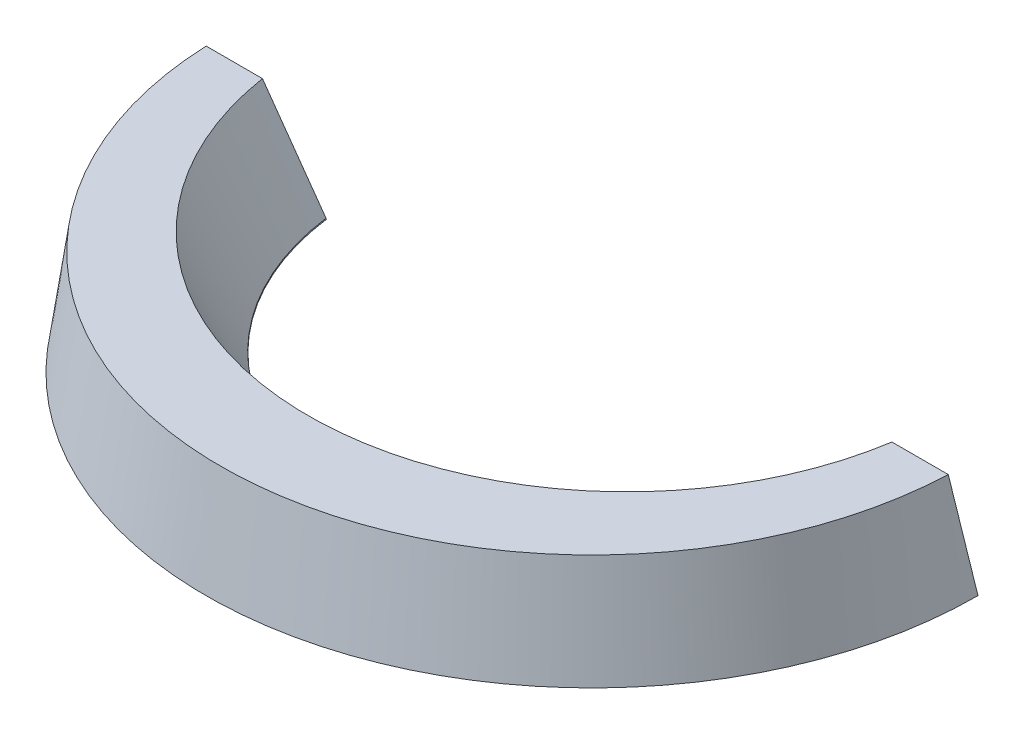
ISO-10303-21;
HEADER;
FILE_DESCRIPTION(('STEP AP214'),'2;1');
FILE_NAME('part.step','',(''),(''),'','','');
FILE_SCHEMA(('AUTOMOTIVE_DESIGN { 1 0 10303 214 1 1 1 1 }'));
ENDSEC;
DATA;
#1=APPLICATION_CONTEXT('core data for automotive mechanical design processes');
#2=APPLICATION_PROTOCOL_DEFINITION('international standard','automotive_design',2000,#1);
#3=PRODUCT_CONTEXT('',#1,'mechanical');
#4=PRODUCT('Part','Part','',(#3));
#5=PRODUCT_RELATED_PRODUCT_CATEGORY('part','',(#4));
#6=PRODUCT_DEFINITION_FORMATION('','',#4);
#7=PRODUCT_DEFINITION_CONTEXT('part definition',#1,'design');
#8=PRODUCT_DEFINITION('design','',#6,#7);
#9=PRODUCT_DEFINITION_SHAPE('','',#8);
#10=(LENGTH_UNIT() NAMED_UNIT(*) SI_UNIT(.MILLI.,.METRE.));
#11=(NAMED_UNIT(*) PLANE_ANGLE_UNIT() SI_UNIT($,.RADIAN.));
#12=(NAMED_UNIT(*) SI_UNIT($,.STERADIAN.) SOLID_ANGLE_UNIT());
#13=UNCERTAINTY_MEASURE_WITH_UNIT(LENGTH_MEASURE(1.E-05),#10,'distance_accuracy_value','');
#14=(GEOMETRIC_REPRESENTATION_CONTEXT(3) GLOBAL_UNCERTAINTY_ASSIGNED_CONTEXT((#13)) GLOBAL_UNIT_ASSIGNED_CONTEXT((#10,
#11,#12)) REPRESENTATION_CONTEXT('',''));
#15=CARTESIAN_POINT('',(0.,0.,0.));
#16=DIRECTION('',(0.,0.,1.));
#17=DIRECTION('',(1.,0.,0.));
#18=AXIS2_PLACEMENT_3D('',#15,#16,#17);
#19=CARTESIAN_POINT('',(0.,0.,3.58433736936286));
#20=DIRECTION('',(0.,1.,0.));
#21=DIRECTION('',(0.,0.,-1.));
#22=AXIS2_PLACEMENT_3D('',#19,#20,#21);
#23=CONICAL_SURFACE('',#22,25.5751568268357,0.139626340159546);
#24=CARTESIAN_POINT('',(-26.5629955569911,10.,8.31277941089816));
#25=CARTESIAN_POINT('',(-26.4648535949786,9.16640273712825,8.19562495576853));
#26=CARTESIAN_POINT('',(-26.3661756955101,8.33286729887674,8.07847918952264));
#27=CARTESIAN_POINT('',(-26.1677106687558,6.66592750995772,7.84420608018933));
#28=CARTESIAN_POINT('',(-26.0679235435354,5.83252315904907,7.72707873706803));
#29=CARTESIAN_POINT('',(-25.8672023340618,4.16584976996568,7.49284306778998));
#30=CARTESIAN_POINT('',(-25.7662682496578,3.33258073180874,7.37573474163575));
#31=CARTESIAN_POINT('',(-25.5632120716551,1.66618305051616,7.14153782056076));
#32=CARTESIAN_POINT('',(-25.4610899758451,0.833054407644768,7.02444922567714));
#33=CARTESIAN_POINT('',(-25.3583535305899,0.,6.90737106387424));
#34=B_SPLINE_CURVE_WITH_KNOTS('',3,(#24,#25,#26,#27,#28,#29,#30,#31,#32,#33),.UNSPECIFIED.,.F.,
.F.,(4,2,2,2,4),(0.,2.54247363179784,5.08494253063913,7.62741176378573,10.1698857300332),.UNSPECIFIED.);
#35=CARTESIAN_POINT('',(-25.3703526458603,0.0973193125842275,6.92104840129749));
#36=VERTEX_POINT('',#35);
#37=CARTESIAN_POINT('',(-25.35835353059,0.,6.90737106387424));
#38=VERTEX_POINT('',#37);
#39=EDGE_CURVE('E97',#36,#38,#34,.T.);
#40=ORIENTED_EDGE('',*,*,#39,.F.);
#41=CARTESIAN_POINT('',(0.,0.0973193125842209,3.58433736936286));
#42=DIRECTION('',(0.,-1.,0.));
#43=DIRECTION('',(0.,0.,-1.));
#44=AXIS2_PLACEMENT_3D('',#41,#42,#43);
#45=CIRCLE('',#44,25.588834164259);
#46=CARTESIAN_POINT('',(25.3703526458603,0.0973193125842257,6.92104840129749));
#47=VERTEX_POINT('',#46);
#48=EDGE_CURVE('E63',#36,#47,#45,.F.);
#49=ORIENTED_EDGE('',*,*,#48,.T.);
#50=CARTESIAN_POINT('',(26.5629955569911,10.,8.31277941089816));
#51=CARTESIAN_POINT('',(26.4648535949786,9.16640273712825,8.19562495576853));
#52=CARTESIAN_POINT('',(26.3661756955101,8.33286729887674,8.07847918952264));
#53=CARTESIAN_POINT('',(26.1677106687558,6.66592750995772,7.84420608018933));
#54=CARTESIAN_POINT('',(26.0679235435354,5.83252315904907,7.72707873706803));
#55=CARTESIAN_POINT('',(25.8672023340618,4.16584976996568,7.49284306778998));
#56=CARTESIAN_POINT('',(25.7662682496578,3.33258073180874,7.37573474163575));
#57=CARTESIAN_POINT('',(25.5632120716551,1.66618305051616,7.14153782056076));
#58=CARTESIAN_POINT('',(25.4610899758451,0.833054407644768,7.02444922567714));
#59=CARTESIAN_POINT('',(25.3583535305899,0.,6.90737106387424));
#60=B_SPLINE_CURVE_WITH_KNOTS('',3,(#50,#51,#52,#53,#54,#55,#56,#57,#58,#59),.UNSPECIFIED.,.F.,
.F.,(4,2,2,2,4),(0.,2.54247363179784,5.08494253063913,7.62741176378573,10.1698857300332),.UNSPECIFIED.);
#61=CARTESIAN_POINT('',(25.35835353059,0.,6.90737106387424));
#62=VERTEX_POINT('',#61);
#63=EDGE_CURVE('E117',#47,#62,#60,.T.);
#64=ORIENTED_EDGE('',*,*,#63,.T.);
#65=CARTESIAN_POINT('',(0.,0.,3.58433736936286));
#66=DIRECTION('',(0.,-1.,0.));
#67=DIRECTION('',(0.,0.,-1.));
#68=AXIS2_PLACEMENT_3D('',#65,#66,#67);
#69=CIRCLE('',#68,25.5751568268357);
#70=EDGE_CURVE('E113',#62,#38,#69,.T.);
#71=ORIENTED_EDGE('',*,*,#70,.T.);
#72=EDGE_LOOP('',(#40,#49,#64,#71));
#73=FACE_BOUND('',#72,.T.);
#74=ADVANCED_FACE('F47',(#73),#23,.F.);
#75=CARTESIAN_POINT('',(-36.85835353059,0.,6.90737106387424));
#76=DIRECTION('',(0.,0.139173100960065,-0.99026806874157));
#77=DIRECTION('',(0.,0.99026806874157,0.139173100960065));
#78=AXIS2_PLACEMENT_3D('',#75,#76,#77);
#79=PLANE('',#78);
#80=DIRECTION('',(1.,0.,0.));
#81=VECTOR('',#80,1.);
#82=CARTESIAN_POINT('',(0.,10.,8.31277941089816));
#83=LINE('',#82,#81);
#84=CARTESIAN_POINT('',(-30.0489400098399,10.,8.31277941089816));
#85=VERTEX_POINT('',#84);
#86=CARTESIAN_POINT('',(-35.4250779754548,10.,8.31277941089816));
#87=VERTEX_POINT('',#86);
#88=EDGE_CURVE('E126',#85,#87,#83,.F.);
#89=ORIENTED_EDGE('',*,*,#88,.F.);
#90=CARTESIAN_POINT('',(-30.0489400098399,10.,8.31277941089816));
#91=CARTESIAN_POINT('',(-29.6596242635314,9.17451422753489,8.19676495140096));
#92=CARTESIAN_POINT('',(-29.2701902911837,8.34908312023935,8.08075817459233));
#93=CARTESIAN_POINT('',(-28.4910520542104,6.69834615043134,7.84876222298141));
#94=CARTESIAN_POINT('',(-28.1013477896218,5.8730402879018,7.73277304817673));
#95=CARTESIAN_POINT('',(-27.3216350092375,4.22256947031659,7.50081450182137));
#96=CARTESIAN_POINT('',(-26.9316264934321,3.39740451526544,7.38484513027132));
#97=CARTESIAN_POINT('',(-26.1512614726042,1.74723584808876,7.15292904838658));
#98=CARTESIAN_POINT('',(-25.7609049675343,0.922232135985274,7.03698233805498));
#99=CARTESIAN_POINT('',(-25.3703526458603,0.0973193125842231,6.92104840129749));
#100=B_SPLINE_CURVE_WITH_KNOTS('',3,(#90,#91,#92,#93,#94,#95,#96,#97,#98,#99),.UNSPECIFIED.,.F.,
.F.,(4,2,2,2,4),(0.,2.76008619992073,5.52017202320197,8.28025793496148,11.0403442237907),.UNSPECIFIED.);
#101=EDGE_CURVE('E77',#85,#36,#100,.T.);
#102=ORIENTED_EDGE('',*,*,#101,.T.);
#103=ORIENTED_EDGE('',*,*,#39,.T.);
#104=DIRECTION('',(-1.,0.,0.));
#105=VECTOR('',#104,1.);
#106=CARTESIAN_POINT('',(-36.85835353059,0.,6.90737106387424));
#107=LINE('',#106,#105);
#108=CARTESIAN_POINT('',(-36.85835353059,0.,6.90737106387424));
#109=VERTEX_POINT('',#108);
#110=EDGE_CURVE('E101',#38,#109,#107,.T.);
#111=ORIENTED_EDGE('',*,*,#110,.T.);
#112=CARTESIAN_POINT('',(-35.4250779754548,10.,8.31277941089816));
#113=CARTESIAN_POINT('',(-35.5468846748251,9.1670007610613,8.19570900255125));
#114=CARTESIAN_POINT('',(-35.6680766226133,8.33391342353776,8.0786262127557));
#115=CARTESIAN_POINT('',(-35.9092656086842,6.66757075478054,7.84443702318835));
#116=CARTESIAN_POINT('',(-36.02926264924,5.8343154238695,7.7273306234619));
#117=CARTESIAN_POINT('',(-36.2680968655935,4.16764188677262,7.49309493338192));
#118=CARTESIAN_POINT('',(-36.3869340415092,3.33422368060334,7.37596564303072));
#119=CARTESIAN_POINT('',(-36.6234811659889,1.66722878806123,7.14168478938822));
#120=CARTESIAN_POINT('',(-36.7411911124079,0.833652101389887,7.02453322605498));
#121=CARTESIAN_POINT('',(-36.85835353059,0.,6.90737106387424));
#122=B_SPLINE_CURVE_WITH_KNOTS('',3,(#112,#113,#114,#115,#116,#117,#118,#119,#120,#121),
.UNSPECIFIED.,.F.,.F.,(4,2,2,2,4),(0.,2.5498763130772,5.09974777478798,7.64961897721964,
10.1994950309336),.UNSPECIFIED.);
#123=EDGE_CURVE('E106',#87,#109,#122,.T.);
#124=ORIENTED_EDGE('',*,*,#123,.F.);
#125=EDGE_LOOP('',(#89,#102,#103,#111,#124));
#126=FACE_BOUND('',#125,.T.);
#127=ADVANCED_FACE('F99',(#126),#79,.T.);
#128=CARTESIAN_POINT('',(0.,0.,6.90737106387424));
#129=DIRECTION('',(0.,-1.,0.));
#130=DIRECTION('',(0.,0.,-1.));
#131=AXIS2_PLACEMENT_3D('',#128,#129,#130);
#132=CONICAL_SURFACE('',#131,36.85835353059,0.139626340159546);
#133=CARTESIAN_POINT('',(0.,0.,6.90737106387424));
#134=DIRECTION('',(0.,1.,0.));
#135=DIRECTION('',(0.,0.,-1.));
#136=AXIS2_PLACEMENT_3D('',#133,#134,#135);
#137=CIRCLE('',#136,36.85835353059);
#138=CARTESIAN_POINT('',(36.85835353059,0.,6.90737106387424));
#139=VERTEX_POINT('',#138);
#140=EDGE_CURVE('E114',#109,#139,#137,.T.);
#141=ORIENTED_EDGE('',*,*,#140,.T.);
#142=CARTESIAN_POINT('',(35.4250779754548,10.,8.31277941089816));
#143=CARTESIAN_POINT('',(35.5468846748251,9.1670007610613,8.19570900255125));
#144=CARTESIAN_POINT('',(35.6680766226133,8.33391342353776,8.0786262127557));
#145=CARTESIAN_POINT('',(35.9092656086842,6.66757075478054,7.84443702318835));
#146=CARTESIAN_POINT('',(36.02926264924,5.8343154238695,7.7273306234619));
#147=CARTESIAN_POINT('',(36.2680968655935,4.16764188677262,7.49309493338192));
#148=CARTESIAN_POINT('',(36.3869340415092,3.33422368060334,7.37596564303072));
#149=CARTESIAN_POINT('',(36.6234811659889,1.66722878806123,7.14168478938822));
#150=CARTESIAN_POINT('',(36.7411911124079,0.833652101389887,7.02453322605498));
#151=CARTESIAN_POINT('',(36.85835353059,0.,6.90737106387424));
#152=B_SPLINE_CURVE_WITH_KNOTS('',3,(#142,#143,#144,#145,#146,#147,#148,#149,#150,#151),
.UNSPECIFIED.,.F.,.F.,(4,2,2,2,4),(0.,2.5498763130772,5.09974777478798,7.64961897721964,
10.1994950309336),.UNSPECIFIED.);
#153=CARTESIAN_POINT('',(35.4250779754548,10.,8.31277941089816));
#154=VERTEX_POINT('',#153);
#155=EDGE_CURVE('E153',#154,#139,#152,.T.);
#156=ORIENTED_EDGE('',*,*,#155,.F.);
#157=CARTESIAN_POINT('',(0.,10.,6.90737106387424));
#158=DIRECTION('',(0.,-1.,0.));
#159=DIRECTION('',(0.,0.,-1.));
#160=AXIS2_PLACEMENT_3D('',#157,#158,#159);
#161=CIRCLE('',#160,35.452945183566);
#162=EDGE_CURVE('E169',#87,#154,#161,.F.);
#163=ORIENTED_EDGE('',*,*,#162,.F.);
#164=ORIENTED_EDGE('',*,*,#123,.T.);
#165=EDGE_LOOP('',(#141,#156,#163,#164));
#166=FACE_BOUND('',#165,.T.);
#167=ADVANCED_FACE('F148',(#166),#132,.T.);
#168=CARTESIAN_POINT('',(36.85835353059,0.,6.90737106387424));
#169=DIRECTION('',(0.,0.139173100960065,-0.99026806874157));
#170=DIRECTION('',(0.,0.99026806874157,0.139173100960065));
#171=AXIS2_PLACEMENT_3D('',#168,#169,#170);
#172=PLANE('',#171);
#173=ORIENTED_EDGE('',*,*,#63,.F.);
#174=CARTESIAN_POINT('',(25.3703526458603,0.0973193125842277,6.92104840129749));
#175=CARTESIAN_POINT('',(25.7609049675343,0.922232135985276,7.03698233805498));
#176=CARTESIAN_POINT('',(26.1512614726042,1.74723584808876,7.15292904838658));
#177=CARTESIAN_POINT('',(26.9316264934321,3.39740451526544,7.38484513027132));
#178=CARTESIAN_POINT('',(27.3216350092375,4.2225694703166,7.50081450182137));
#179=CARTESIAN_POINT('',(28.1013477896218,5.87304028790181,7.73277304817674));
#180=CARTESIAN_POINT('',(28.4910520542104,6.69834615043135,7.84876222298142));
#181=CARTESIAN_POINT('',(29.2701902911837,8.34908312023935,8.08075817459233));
#182=CARTESIAN_POINT('',(29.6596242635314,9.17451422753489,8.19676495140096));
#183=CARTESIAN_POINT('',(30.0489400098399,10.,8.31277941089816));
#184=B_SPLINE_CURVE_WITH_KNOTS('',3,(#174,#175,#176,#177,#178,#179,#180,#181,#182,#183),
.UNSPECIFIED.,.F.,.F.,(4,2,2,2,4),(0.,2.7600862888292,5.52017220058871,8.28025802386995,
11.0403442237907),.UNSPECIFIED.);
#185=CARTESIAN_POINT('',(30.0489400098399,10.,8.31277941089816));
#186=VERTEX_POINT('',#185);
#187=EDGE_CURVE('E11',#47,#186,#184,.T.);
#188=ORIENTED_EDGE('',*,*,#187,.T.);
#189=DIRECTION('',(1.,0.,0.));
#190=VECTOR('',#189,1.);
#191=CARTESIAN_POINT('',(0.,10.,8.31277941089816));
#192=LINE('',#191,#190);
#193=EDGE_CURVE('E172',#154,#186,#192,.F.);
#194=ORIENTED_EDGE('',*,*,#193,.F.);
#195=ORIENTED_EDGE('',*,*,#155,.T.);
#196=DIRECTION('',(-1.,0.,0.));
#197=VECTOR('',#196,1.);
#198=CARTESIAN_POINT('',(36.85835353059,0.,6.90737106387424));
#199=LINE('',#198,#197);
#200=EDGE_CURVE('E124',#139,#62,#199,.T.);
#201=ORIENTED_EDGE('',*,*,#200,.T.);
#202=EDGE_LOOP('',(#173,#188,#194,#195,#201));
#203=FACE_BOUND('',#202,.T.);
#204=ADVANCED_FACE('F143',(#203),#172,.T.);
#205=CARTESIAN_POINT('',(0.,10.,3.58433736936286));
#206=DIRECTION('',(0.,-1.,0.));
#207=DIRECTION('',(0.,0.,-1.));
#208=AXIS2_PLACEMENT_3D('',#205,#206,#207);
#209=PLANE('',#208);
#210=ORIENTED_EDGE('',*,*,#193,.T.);
#211=CARTESIAN_POINT('',(0.,10.,3.58433736936286));
#212=DIRECTION('',(0.,-1.,0.));
#213=DIRECTION('',(0.,0.,-1.));
#214=AXIS2_PLACEMENT_3D('',#211,#212,#213);
#215=CIRCLE('',#214,30.4186942496734);
#216=EDGE_CURVE('E105',#186,#85,#215,.T.);
#217=ORIENTED_EDGE('',*,*,#216,.T.);
#218=ORIENTED_EDGE('',*,*,#88,.T.);
#219=ORIENTED_EDGE('',*,*,#162,.T.);
#220=EDGE_LOOP('',(#210,#217,#218,#219));
#221=FACE_BOUND('',#220,.T.);
#222=ADVANCED_FACE('F147',(#221),#209,.F.);
#223=CARTESIAN_POINT('',(0.,0.,3.58433736936286));
#224=DIRECTION('',(0.,-1.,0.));
#225=DIRECTION('',(0.,0.,-1.));
#226=AXIS2_PLACEMENT_3D('',#223,#224,#225);
#227=PLANE('',#226);
#228=ORIENTED_EDGE('',*,*,#70,.F.);
#229=ORIENTED_EDGE('',*,*,#200,.F.);
#230=ORIENTED_EDGE('',*,*,#140,.F.);
#231=ORIENTED_EDGE('',*,*,#110,.F.);
#232=EDGE_LOOP('',(#228,#229,#230,#231));
#233=FACE_BOUND('',#232,.T.);
#234=ADVANCED_FACE('F111',(#233),#227,.T.);
#235=CARTESIAN_POINT('',(0.,10.,3.58433736936286));
#236=DIRECTION('',(0.,1.,0.));
#237=DIRECTION('',(0.,0.,1.));
#238=AXIS2_PLACEMENT_3D('',#235,#236,#237);
#239=CONICAL_SURFACE('',#238,30.4186942496734,0.453785605518524);
#240=ORIENTED_EDGE('',*,*,#187,.F.);
#241=ORIENTED_EDGE('',*,*,#48,.F.);
#242=ORIENTED_EDGE('',*,*,#101,.F.);
#243=ORIENTED_EDGE('',*,*,#216,.F.);
#244=EDGE_LOOP('',(#240,#241,#242,#243));
#245=FACE_BOUND('',#244,.T.);
#246=ADVANCED_FACE('F50',(#245),#239,.F.);
#247=CLOSED_SHELL('',(#74,#127,#167,#204,#222,#234,#246));
#248=MANIFOLD_SOLID_BREP('B2',#247);
#249=ADVANCED_BREP_SHAPE_REPRESENTATION('',(#18,#248),#14);
#250=SHAPE_DEFINITION_REPRESENTATION(#9,#249);
ENDSEC;
END-ISO-10303-21;
